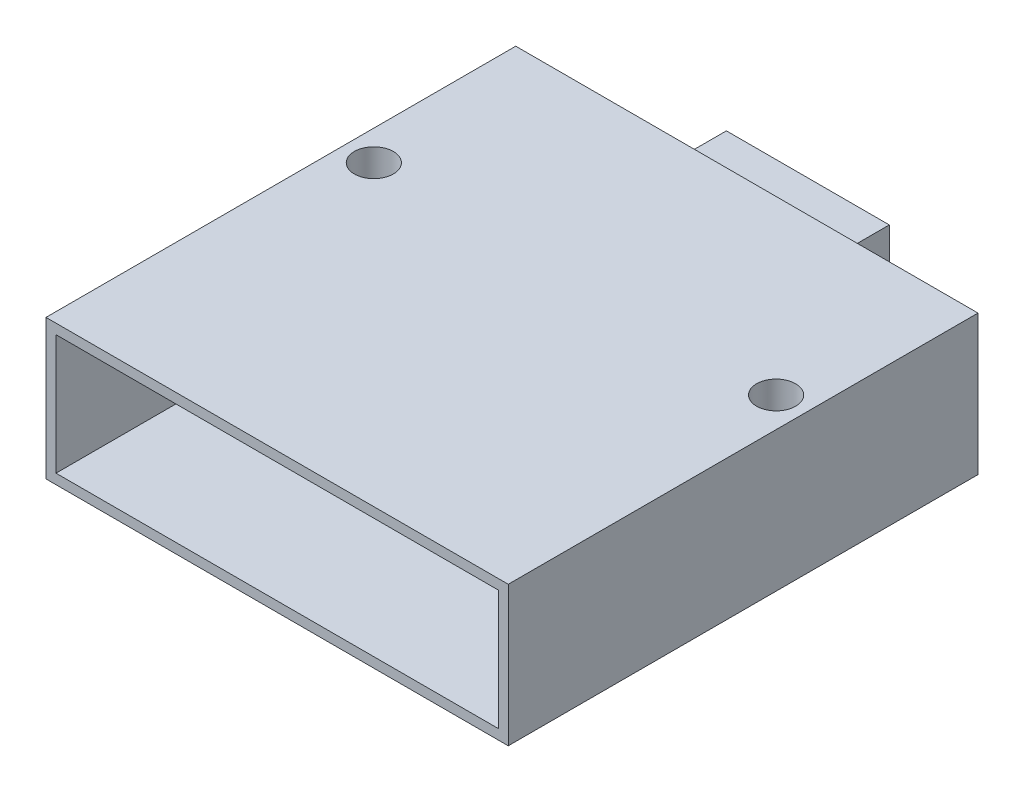
ISO-10303-21;
HEADER;
FILE_DESCRIPTION(('STEP AP214'),'2;1');
FILE_NAME('part.step','',(''),(''),'','','');
FILE_SCHEMA(('AUTOMOTIVE_DESIGN { 1 0 10303 214 1 1 1 1 }'));
ENDSEC;
DATA;
#1=APPLICATION_CONTEXT('core data for automotive mechanical design processes');
#2=APPLICATION_PROTOCOL_DEFINITION('international standard','automotive_design',2000,#1);
#3=PRODUCT_CONTEXT('',#1,'mechanical');
#4=PRODUCT('Part','Part','',(#3));
#5=PRODUCT_RELATED_PRODUCT_CATEGORY('part','',(#4));
#6=PRODUCT_DEFINITION_FORMATION('','',#4);
#7=PRODUCT_DEFINITION_CONTEXT('part definition',#1,'design');
#8=PRODUCT_DEFINITION('design','',#6,#7);
#9=PRODUCT_DEFINITION_SHAPE('','',#8);
#10=(LENGTH_UNIT() NAMED_UNIT(*) SI_UNIT(.MILLI.,.METRE.));
#11=(NAMED_UNIT(*) PLANE_ANGLE_UNIT() SI_UNIT($,.RADIAN.));
#12=(NAMED_UNIT(*) SI_UNIT($,.STERADIAN.) SOLID_ANGLE_UNIT());
#13=UNCERTAINTY_MEASURE_WITH_UNIT(LENGTH_MEASURE(1.E-05),#10,'distance_accuracy_value','');
#14=(GEOMETRIC_REPRESENTATION_CONTEXT(3) GLOBAL_UNCERTAINTY_ASSIGNED_CONTEXT((#13)) GLOBAL_UNIT_ASSIGNED_CONTEXT((#10,
#11,#12)) REPRESENTATION_CONTEXT('',''));
#15=CARTESIAN_POINT('',(0.,0.,0.));
#16=DIRECTION('',(0.,0.,1.));
#17=DIRECTION('',(1.,0.,0.));
#18=AXIS2_PLACEMENT_3D('',#15,#16,#17);
#19=CARTESIAN_POINT('',(58.7375,17.78,119.38));
#20=DIRECTION('',(0.,0.,-1.));
#21=DIRECTION('',(-1.,0.,0.));
#22=AXIS2_PLACEMENT_3D('',#19,#20,#21);
#23=PLANE('',#22);
#24=DIRECTION('',(0.,1.,0.));
#25=VECTOR('',#24,1.);
#26=CARTESIAN_POINT('',(58.7375,-17.78,119.38));
#27=LINE('',#26,#25);
#28=CARTESIAN_POINT('',(58.7375,-17.78,119.38));
#29=VERTEX_POINT('',#28);
#30=CARTESIAN_POINT('',(58.7375,17.78,119.38));
#31=VERTEX_POINT('',#30);
#32=EDGE_CURVE('E332',#29,#31,#27,.T.);
#33=ORIENTED_EDGE('',*,*,#32,.T.);
#34=DIRECTION('',(-1.,0.,0.));
#35=VECTOR('',#34,1.);
#36=CARTESIAN_POINT('',(-58.7375,17.78,119.38));
#37=LINE('',#36,#35);
#38=CARTESIAN_POINT('',(-58.7375,17.78,119.38));
#39=VERTEX_POINT('',#38);
#40=EDGE_CURVE('E335',#31,#39,#37,.T.);
#41=ORIENTED_EDGE('',*,*,#40,.T.);
#42=DIRECTION('',(0.,-1.,0.));
#43=VECTOR('',#42,1.);
#44=CARTESIAN_POINT('',(-58.7375,-17.78,119.38));
#45=LINE('',#44,#43);
#46=CARTESIAN_POINT('',(-58.7375,-17.78,119.38));
#47=VERTEX_POINT('',#46);
#48=EDGE_CURVE('E338',#39,#47,#45,.T.);
#49=ORIENTED_EDGE('',*,*,#48,.T.);
#50=DIRECTION('',(1.,0.,0.));
#51=VECTOR('',#50,1.);
#52=CARTESIAN_POINT('',(-58.7375,-17.78,119.38));
#53=LINE('',#52,#51);
#54=EDGE_CURVE('E340',#47,#29,#53,.T.);
#55=ORIENTED_EDGE('',*,*,#54,.T.);
#56=EDGE_LOOP('',(#33,#41,#49,#55));
#57=FACE_BOUND('',#56,.T.);
#58=DIRECTION('',(0.,1.,0.));
#59=VECTOR('',#58,1.);
#60=CARTESIAN_POINT('',(56.1975,17.78,119.38));
#61=LINE('',#60,#59);
#62=CARTESIAN_POINT('',(56.1975,-15.24,119.38));
#63=VERTEX_POINT('',#62);
#64=CARTESIAN_POINT('',(56.1975,15.24,119.38));
#65=VERTEX_POINT('',#64);
#66=EDGE_CURVE('E199',#63,#65,#61,.T.);
#67=ORIENTED_EDGE('',*,*,#66,.F.);
#68=DIRECTION('',(1.,0.,0.));
#69=VECTOR('',#68,1.);
#70=CARTESIAN_POINT('',(58.7375,-15.24,119.38));
#71=LINE('',#70,#69);
#72=CARTESIAN_POINT('',(-56.1975,-15.24,119.38));
#73=VERTEX_POINT('',#72);
#74=EDGE_CURVE('E279',#73,#63,#71,.T.);
#75=ORIENTED_EDGE('',*,*,#74,.F.);
#76=DIRECTION('',(0.,-1.,0.));
#77=VECTOR('',#76,1.);
#78=CARTESIAN_POINT('',(-56.1975,17.78,119.38));
#79=LINE('',#78,#77);
#80=CARTESIAN_POINT('',(-56.1975,15.24,119.38));
#81=VERTEX_POINT('',#80);
#82=EDGE_CURVE('E277',#81,#73,#79,.T.);
#83=ORIENTED_EDGE('',*,*,#82,.F.);
#84=DIRECTION('',(-1.,0.,0.));
#85=VECTOR('',#84,1.);
#86=CARTESIAN_POINT('',(58.7375,15.24,119.38));
#87=LINE('',#86,#85);
#88=EDGE_CURVE('E274',#65,#81,#87,.T.);
#89=ORIENTED_EDGE('',*,*,#88,.F.);
#90=EDGE_LOOP('',(#67,#75,#83,#89));
#91=FACE_BOUND('',#90,.T.);
#92=ADVANCED_FACE('F45',(#57,#91),#23,.F.);
#93=CARTESIAN_POINT('',(58.7375,17.78,0.));
#94=DIRECTION('',(0.,0.,-1.));
#95=DIRECTION('',(-1.,0.,0.));
#96=AXIS2_PLACEMENT_3D('',#93,#94,#95);
#97=PLANE('',#96);
#98=DIRECTION('',(0.,1.,0.));
#99=VECTOR('',#98,1.);
#100=CARTESIAN_POINT('',(58.7375,-17.78,0.));
#101=LINE('',#100,#99);
#102=CARTESIAN_POINT('',(58.7375,-17.78,0.));
#103=VERTEX_POINT('',#102);
#104=CARTESIAN_POINT('',(58.7375,17.78,0.));
#105=VERTEX_POINT('',#104);
#106=EDGE_CURVE('E331',#103,#105,#101,.T.);
#107=ORIENTED_EDGE('',*,*,#106,.F.);
#108=DIRECTION('',(1.,0.,0.));
#109=VECTOR('',#108,1.);
#110=CARTESIAN_POINT('',(-58.7375,-17.78,0.));
#111=LINE('',#110,#109);
#112=CARTESIAN_POINT('',(-58.7375,-17.78,0.));
#113=VERTEX_POINT('',#112);
#114=EDGE_CURVE('E336',#113,#103,#111,.T.);
#115=ORIENTED_EDGE('',*,*,#114,.F.);
#116=DIRECTION('',(0.,-1.,0.));
#117=VECTOR('',#116,1.);
#118=CARTESIAN_POINT('',(-58.7375,-17.78,0.));
#119=LINE('',#118,#117);
#120=CARTESIAN_POINT('',(-58.7375,17.78,0.));
#121=VERTEX_POINT('',#120);
#122=EDGE_CURVE('E347',#121,#113,#119,.T.);
#123=ORIENTED_EDGE('',*,*,#122,.F.);
#124=DIRECTION('',(-1.,0.,0.));
#125=VECTOR('',#124,1.);
#126=CARTESIAN_POINT('',(-58.7375,17.78,0.));
#127=LINE('',#126,#125);
#128=EDGE_CURVE('E345',#105,#121,#127,.T.);
#129=ORIENTED_EDGE('',*,*,#128,.F.);
#130=EDGE_LOOP('',(#107,#115,#123,#129));
#131=FACE_BOUND('',#130,.T.);
#132=DIRECTION('',(1.,0.,0.));
#133=VECTOR('',#132,1.);
#134=CARTESIAN_POINT('',(20.701,10.414,0.));
#135=LINE('',#134,#133);
#136=CARTESIAN_POINT('',(-20.701,10.414,0.));
#137=VERTEX_POINT('',#136);
#138=CARTESIAN_POINT('',(20.701,10.414,0.));
#139=VERTEX_POINT('',#138);
#140=EDGE_CURVE('E318',#137,#139,#135,.T.);
#141=ORIENTED_EDGE('',*,*,#140,.F.);
#142=DIRECTION('',(0.,1.,0.));
#143=VECTOR('',#142,1.);
#144=CARTESIAN_POINT('',(-20.701,-10.414,0.));
#145=LINE('',#144,#143);
#146=CARTESIAN_POINT('',(-20.701,-10.414,0.));
#147=VERTEX_POINT('',#146);
#148=EDGE_CURVE('E304',#147,#137,#145,.T.);
#149=ORIENTED_EDGE('',*,*,#148,.F.);
#150=DIRECTION('',(-1.,0.,0.));
#151=VECTOR('',#150,1.);
#152=CARTESIAN_POINT('',(20.701,-10.414,0.));
#153=LINE('',#152,#151);
#154=CARTESIAN_POINT('',(20.701,-10.414,0.));
#155=VERTEX_POINT('',#154);
#156=EDGE_CURVE('E309',#155,#147,#153,.T.);
#157=ORIENTED_EDGE('',*,*,#156,.F.);
#158=DIRECTION('',(0.,-1.,0.));
#159=VECTOR('',#158,1.);
#160=CARTESIAN_POINT('',(20.701,-10.414,0.));
#161=LINE('',#160,#159);
#162=EDGE_CURVE('E320',#139,#155,#161,.T.);
#163=ORIENTED_EDGE('',*,*,#162,.F.);
#164=EDGE_LOOP('',(#141,#149,#157,#163));
#165=FACE_BOUND('',#164,.T.);
#166=ADVANCED_FACE('F368',(#131,#165),#97,.T.);
#167=CARTESIAN_POINT('',(58.7375,-17.78,119.38));
#168=DIRECTION('',(-1.,0.,0.));
#169=DIRECTION('',(0.,0.,1.));
#170=AXIS2_PLACEMENT_3D('',#167,#168,#169);
#171=PLANE('',#170);
#172=ORIENTED_EDGE('',*,*,#106,.T.);
#173=DIRECTION('',(0.,0.,-1.));
#174=VECTOR('',#173,1.);
#175=CARTESIAN_POINT('',(58.7375,17.78,119.38));
#176=LINE('',#175,#174);
#177=EDGE_CURVE('E11',#31,#105,#176,.T.);
#178=ORIENTED_EDGE('',*,*,#177,.F.);
#179=ORIENTED_EDGE('',*,*,#32,.F.);
#180=DIRECTION('',(0.,0.,-1.));
#181=VECTOR('',#180,1.);
#182=CARTESIAN_POINT('',(58.7375,-17.78,119.38));
#183=LINE('',#182,#181);
#184=EDGE_CURVE('E342',#29,#103,#183,.T.);
#185=ORIENTED_EDGE('',*,*,#184,.T.);
#186=EDGE_LOOP('',(#172,#178,#179,#185));
#187=FACE_BOUND('',#186,.T.);
#188=ADVANCED_FACE('F47',(#187),#171,.F.);
#189=CARTESIAN_POINT('',(-58.7375,17.78,119.38));
#190=DIRECTION('',(0.,-1.,0.));
#191=DIRECTION('',(0.,0.,-1.));
#192=AXIS2_PLACEMENT_3D('',#189,#190,#191);
#193=PLANE('',#192);
#194=CARTESIAN_POINT('',(-51.1175,17.78,43.688));
#195=DIRECTION('',(0.,-1.,0.));
#196=DIRECTION('',(0.,0.,-1.));
#197=AXIS2_PLACEMENT_3D('',#194,#195,#196);
#198=CIRCLE('',#197,4.96100099999999);
#199=CARTESIAN_POINT('',(-51.1175,17.78,38.726999));
#200=VERTEX_POINT('',#199);
#201=EDGE_CURVE('E294',#200,#200,#198,.T.);
#202=ORIENTED_EDGE('',*,*,#201,.T.);
#203=EDGE_LOOP('',(#202));
#204=FACE_BOUND('',#203,.T.);
#205=CARTESIAN_POINT('',(51.1175,17.78,43.688));
#206=DIRECTION('',(0.,-1.,0.));
#207=DIRECTION('',(0.,0.,-1.));
#208=AXIS2_PLACEMENT_3D('',#205,#206,#207);
#209=CIRCLE('',#208,4.96100099999999);
#210=CARTESIAN_POINT('',(51.1175,17.78,38.726999));
#211=VERTEX_POINT('',#210);
#212=EDGE_CURVE('E301',#211,#211,#209,.T.);
#213=ORIENTED_EDGE('',*,*,#212,.T.);
#214=EDGE_LOOP('',(#213));
#215=FACE_BOUND('',#214,.T.);
#216=ORIENTED_EDGE('',*,*,#128,.T.);
#217=DIRECTION('',(0.,0.,-1.));
#218=VECTOR('',#217,1.);
#219=CARTESIAN_POINT('',(-58.7375,17.78,119.38));
#220=LINE('',#219,#218);
#221=EDGE_CURVE('E54',#39,#121,#220,.T.);
#222=ORIENTED_EDGE('',*,*,#221,.F.);
#223=ORIENTED_EDGE('',*,*,#40,.F.);
#224=ORIENTED_EDGE('',*,*,#177,.T.);
#225=EDGE_LOOP('',(#216,#222,#223,#224));
#226=FACE_BOUND('',#225,.T.);
#227=ADVANCED_FACE('F379',(#204,#215,#226),#193,.F.);
#228=CARTESIAN_POINT('',(-58.7375,-17.78,119.38));
#229=DIRECTION('',(1.,0.,0.));
#230=DIRECTION('',(0.,0.,-1.));
#231=AXIS2_PLACEMENT_3D('',#228,#229,#230);
#232=PLANE('',#231);
#233=ORIENTED_EDGE('',*,*,#122,.T.);
#234=DIRECTION('',(0.,0.,-1.));
#235=VECTOR('',#234,1.);
#236=CARTESIAN_POINT('',(-58.7375,-17.78,119.38));
#237=LINE('',#236,#235);
#238=EDGE_CURVE('E353',#47,#113,#237,.T.);
#239=ORIENTED_EDGE('',*,*,#238,.F.);
#240=ORIENTED_EDGE('',*,*,#48,.F.);
#241=ORIENTED_EDGE('',*,*,#221,.T.);
#242=EDGE_LOOP('',(#233,#239,#240,#241));
#243=FACE_BOUND('',#242,.T.);
#244=ADVANCED_FACE('F362',(#243),#232,.F.);
#245=CARTESIAN_POINT('',(-58.7375,-17.78,119.38));
#246=DIRECTION('',(0.,1.,0.));
#247=DIRECTION('',(0.,0.,1.));
#248=AXIS2_PLACEMENT_3D('',#245,#246,#247);
#249=PLANE('',#248);
#250=CARTESIAN_POINT('',(-51.1175,-17.78,43.688));
#251=DIRECTION('',(0.,-1.,0.));
#252=DIRECTION('',(0.,0.,-1.));
#253=AXIS2_PLACEMENT_3D('',#250,#251,#252);
#254=CIRCLE('',#253,4.96100099999999);
#255=CARTESIAN_POINT('',(-51.1175,-17.78,38.726999));
#256=VERTEX_POINT('',#255);
#257=EDGE_CURVE('E290',#256,#256,#254,.T.);
#258=ORIENTED_EDGE('',*,*,#257,.F.);
#259=EDGE_LOOP('',(#258));
#260=FACE_BOUND('',#259,.T.);
#261=CARTESIAN_POINT('',(51.1175,-17.78,43.688));
#262=DIRECTION('',(0.,-1.,0.));
#263=DIRECTION('',(0.,0.,-1.));
#264=AXIS2_PLACEMENT_3D('',#261,#262,#263);
#265=CIRCLE('',#264,4.96100099999999);
#266=CARTESIAN_POINT('',(51.1175,-17.78,38.726999));
#267=VERTEX_POINT('',#266);
#268=EDGE_CURVE('E298',#267,#267,#265,.T.);
#269=ORIENTED_EDGE('',*,*,#268,.F.);
#270=EDGE_LOOP('',(#269));
#271=FACE_BOUND('',#270,.T.);
#272=ORIENTED_EDGE('',*,*,#114,.T.);
#273=ORIENTED_EDGE('',*,*,#184,.F.);
#274=ORIENTED_EDGE('',*,*,#54,.F.);
#275=ORIENTED_EDGE('',*,*,#238,.T.);
#276=EDGE_LOOP('',(#272,#273,#274,#275));
#277=FACE_BOUND('',#276,.T.);
#278=ADVANCED_FACE('F372',(#260,#271,#277),#249,.F.);
#279=CARTESIAN_POINT('',(-20.701,-10.414,-15.494));
#280=DIRECTION('',(1.,0.,0.));
#281=DIRECTION('',(0.,0.,-1.));
#282=AXIS2_PLACEMENT_3D('',#279,#280,#281);
#283=PLANE('',#282);
#284=ORIENTED_EDGE('',*,*,#148,.T.);
#285=DIRECTION('',(0.,0.,1.));
#286=VECTOR('',#285,1.);
#287=CARTESIAN_POINT('',(-20.701,10.414,-15.494));
#288=LINE('',#287,#286);
#289=CARTESIAN_POINT('',(-20.701,10.414,-15.494));
#290=VERTEX_POINT('',#289);
#291=EDGE_CURVE('E329',#290,#137,#288,.T.);
#292=ORIENTED_EDGE('',*,*,#291,.F.);
#293=DIRECTION('',(0.,1.,0.));
#294=VECTOR('',#293,1.);
#295=CARTESIAN_POINT('',(-20.701,-10.414,-15.494));
#296=LINE('',#295,#294);
#297=CARTESIAN_POINT('',(-20.701,-10.414,-15.494));
#298=VERTEX_POINT('',#297);
#299=EDGE_CURVE('E305',#298,#290,#296,.T.);
#300=ORIENTED_EDGE('',*,*,#299,.F.);
#301=DIRECTION('',(0.,0.,1.));
#302=VECTOR('',#301,1.);
#303=CARTESIAN_POINT('',(-20.701,-10.414,-15.494));
#304=LINE('',#303,#302);
#305=EDGE_CURVE('E315',#298,#147,#304,.T.);
#306=ORIENTED_EDGE('',*,*,#305,.T.);
#307=EDGE_LOOP('',(#284,#292,#300,#306));
#308=FACE_BOUND('',#307,.T.);
#309=ADVANCED_FACE('F395',(#308),#283,.F.);
#310=CARTESIAN_POINT('',(20.701,10.414,-15.494));
#311=DIRECTION('',(0.,-1.,0.));
#312=DIRECTION('',(0.,0.,-1.));
#313=AXIS2_PLACEMENT_3D('',#310,#311,#312);
#314=PLANE('',#313);
#315=ORIENTED_EDGE('',*,*,#140,.T.);
#316=DIRECTION('',(0.,0.,1.));
#317=VECTOR('',#316,1.);
#318=CARTESIAN_POINT('',(20.701,10.414,-15.494));
#319=LINE('',#318,#317);
#320=CARTESIAN_POINT('',(20.701,10.414,-15.494));
#321=VERTEX_POINT('',#320);
#322=EDGE_CURVE('E326',#321,#139,#319,.T.);
#323=ORIENTED_EDGE('',*,*,#322,.F.);
#324=DIRECTION('',(1.,0.,0.));
#325=VECTOR('',#324,1.);
#326=CARTESIAN_POINT('',(20.701,10.414,-15.494));
#327=LINE('',#326,#325);
#328=EDGE_CURVE('E308',#290,#321,#327,.T.);
#329=ORIENTED_EDGE('',*,*,#328,.F.);
#330=ORIENTED_EDGE('',*,*,#291,.T.);
#331=EDGE_LOOP('',(#315,#323,#329,#330));
#332=FACE_BOUND('',#331,.T.);
#333=ADVANCED_FACE('F403',(#332),#314,.F.);
#334=CARTESIAN_POINT('',(20.701,-10.414,-15.494));
#335=DIRECTION('',(-1.,0.,0.));
#336=DIRECTION('',(0.,0.,1.));
#337=AXIS2_PLACEMENT_3D('',#334,#335,#336);
#338=PLANE('',#337);
#339=ORIENTED_EDGE('',*,*,#162,.T.);
#340=DIRECTION('',(0.,0.,1.));
#341=VECTOR('',#340,1.);
#342=CARTESIAN_POINT('',(20.701,-10.414,-15.494));
#343=LINE('',#342,#341);
#344=CARTESIAN_POINT('',(20.701,-10.414,-15.494));
#345=VERTEX_POINT('',#344);
#346=EDGE_CURVE('E69',#345,#155,#343,.T.);
#347=ORIENTED_EDGE('',*,*,#346,.F.);
#348=DIRECTION('',(0.,-1.,0.));
#349=VECTOR('',#348,1.);
#350=CARTESIAN_POINT('',(20.701,-10.414,-15.494));
#351=LINE('',#350,#349);
#352=EDGE_CURVE('E311',#321,#345,#351,.T.);
#353=ORIENTED_EDGE('',*,*,#352,.F.);
#354=ORIENTED_EDGE('',*,*,#322,.T.);
#355=EDGE_LOOP('',(#339,#347,#353,#354));
#356=FACE_BOUND('',#355,.T.);
#357=ADVANCED_FACE('F430',(#356),#338,.F.);
#358=CARTESIAN_POINT('',(20.701,-10.414,-15.494));
#359=DIRECTION('',(0.,1.,0.));
#360=DIRECTION('',(0.,0.,1.));
#361=AXIS2_PLACEMENT_3D('',#358,#359,#360);
#362=PLANE('',#361);
#363=ORIENTED_EDGE('',*,*,#156,.T.);
#364=ORIENTED_EDGE('',*,*,#305,.F.);
#365=DIRECTION('',(-1.,0.,0.));
#366=VECTOR('',#365,1.);
#367=CARTESIAN_POINT('',(20.701,-10.414,-15.494));
#368=LINE('',#367,#366);
#369=EDGE_CURVE('E313',#345,#298,#368,.T.);
#370=ORIENTED_EDGE('',*,*,#369,.F.);
#371=ORIENTED_EDGE('',*,*,#346,.T.);
#372=EDGE_LOOP('',(#363,#364,#370,#371));
#373=FACE_BOUND('',#372,.T.);
#374=ADVANCED_FACE('F422',(#373),#362,.F.);
#375=CARTESIAN_POINT('',(-20.701,10.414,-15.494));
#376=DIRECTION('',(0.,0.,1.));
#377=DIRECTION('',(1.,0.,0.));
#378=AXIS2_PLACEMENT_3D('',#375,#376,#377);
#379=PLANE('',#378);
#380=ORIENTED_EDGE('',*,*,#299,.T.);
#381=ORIENTED_EDGE('',*,*,#328,.T.);
#382=ORIENTED_EDGE('',*,*,#352,.T.);
#383=ORIENTED_EDGE('',*,*,#369,.T.);
#384=EDGE_LOOP('',(#380,#381,#382,#383));
#385=FACE_BOUND('',#384,.T.);
#386=ADVANCED_FACE('F412',(#385),#379,.F.);
#387=CARTESIAN_POINT('',(51.1175,-17.78,43.688));
#388=DIRECTION('',(0.,-1.,0.));
#389=DIRECTION('',(0.,0.,-1.));
#390=AXIS2_PLACEMENT_3D('',#387,#388,#389);
#391=CYLINDRICAL_SURFACE('',#390,4.96100099999999);
#392=ORIENTED_EDGE('',*,*,#212,.F.);
#393=EDGE_LOOP('',(#392));
#394=FACE_BOUND('',#393,.T.);
#395=ORIENTED_EDGE('',*,*,#268,.T.);
#396=EDGE_LOOP('',(#395));
#397=FACE_BOUND('',#396,.T.);
#398=ADVANCED_FACE('F409',(#394,#397),#391,.F.);
#399=CARTESIAN_POINT('',(-51.1175,-17.78,43.688));
#400=DIRECTION('',(0.,-1.,0.));
#401=DIRECTION('',(0.,0.,-1.));
#402=AXIS2_PLACEMENT_3D('',#399,#400,#401);
#403=CYLINDRICAL_SURFACE('',#402,4.96100099999999);
#404=ORIENTED_EDGE('',*,*,#201,.F.);
#405=EDGE_LOOP('',(#404));
#406=FACE_BOUND('',#405,.T.);
#407=ORIENTED_EDGE('',*,*,#257,.T.);
#408=EDGE_LOOP('',(#407));
#409=FACE_BOUND('',#408,.T.);
#410=ADVANCED_FACE('F411',(#406,#409),#403,.F.);
#411=CARTESIAN_POINT('',(-56.1975,-17.78,119.38));
#412=DIRECTION('',(1.,0.,0.));
#413=DIRECTION('',(0.,0.,-1.));
#414=AXIS2_PLACEMENT_3D('',#411,#412,#413);
#415=PLANE('',#414);
#416=DIRECTION('',(0.,-1.,0.));
#417=VECTOR('',#416,1.);
#418=CARTESIAN_POINT('',(-56.1975,-17.78,49.2069325056573));
#419=LINE('',#418,#417);
#420=CARTESIAN_POINT('',(-56.1975,-15.24,49.2069325056573));
#421=VERTEX_POINT('',#420);
#422=CARTESIAN_POINT('',(-56.1975,15.24,49.2069325056573));
#423=VERTEX_POINT('',#422);
#424=EDGE_CURVE('E287',#421,#423,#419,.F.);
#425=ORIENTED_EDGE('',*,*,#424,.T.);
#426=DIRECTION('',(0.,0.,-1.));
#427=VECTOR('',#426,1.);
#428=CARTESIAN_POINT('',(-56.1975,15.24,119.38));
#429=LINE('',#428,#427);
#430=EDGE_CURVE('E252',#81,#423,#429,.T.);
#431=ORIENTED_EDGE('',*,*,#430,.F.);
#432=ORIENTED_EDGE('',*,*,#82,.T.);
#433=DIRECTION('',(0.,0.,-1.));
#434=VECTOR('',#433,1.);
#435=CARTESIAN_POINT('',(-56.1975,-15.24,119.38));
#436=LINE('',#435,#434);
#437=EDGE_CURVE('E61',#73,#421,#436,.T.);
#438=ORIENTED_EDGE('',*,*,#437,.T.);
#439=EDGE_LOOP('',(#425,#431,#432,#438));
#440=FACE_BOUND('',#439,.T.);
#441=ADVANCED_FACE('F419',(#440),#415,.T.);
#442=CARTESIAN_POINT('',(56.1975,-17.78,119.38));
#443=DIRECTION('',(-1.,0.,0.));
#444=DIRECTION('',(0.,0.,1.));
#445=AXIS2_PLACEMENT_3D('',#442,#443,#444);
#446=PLANE('',#445);
#447=DIRECTION('',(0.,0.,-1.));
#448=VECTOR('',#447,1.);
#449=CARTESIAN_POINT('',(56.1975,-15.24,119.38));
#450=LINE('',#449,#448);
#451=CARTESIAN_POINT('',(56.1975,-15.24,49.2069325056573));
#452=VERTEX_POINT('',#451);
#453=EDGE_CURVE('E210',#63,#452,#450,.T.);
#454=ORIENTED_EDGE('',*,*,#453,.F.);
#455=ORIENTED_EDGE('',*,*,#66,.T.);
#456=DIRECTION('',(0.,0.,-1.));
#457=VECTOR('',#456,1.);
#458=CARTESIAN_POINT('',(56.1975,15.24,119.38));
#459=LINE('',#458,#457);
#460=CARTESIAN_POINT('',(56.1975,15.24,49.2069325056573));
#461=VERTEX_POINT('',#460);
#462=EDGE_CURVE('E236',#65,#461,#459,.T.);
#463=ORIENTED_EDGE('',*,*,#462,.T.);
#464=DIRECTION('',(0.,-1.,0.));
#465=VECTOR('',#464,1.);
#466=CARTESIAN_POINT('',(56.1975,-17.78,49.2069325056573));
#467=LINE('',#466,#465);
#468=EDGE_CURVE('E282',#452,#461,#467,.F.);
#469=ORIENTED_EDGE('',*,*,#468,.F.);
#470=EDGE_LOOP('',(#454,#455,#463,#469));
#471=FACE_BOUND('',#470,.T.);
#472=ADVANCED_FACE('F496',(#471),#446,.T.);
#473=CARTESIAN_POINT('',(58.7375,17.78,2.54));
#474=DIRECTION('',(0.,0.,-1.));
#475=DIRECTION('',(-1.,0.,0.));
#476=AXIS2_PLACEMENT_3D('',#473,#474,#475);
#477=PLANE('',#476);
#478=DIRECTION('',(0.,1.,0.));
#479=VECTOR('',#478,1.);
#480=CARTESIAN_POINT('',(56.1975,17.78,2.54));
#481=LINE('',#480,#479);
#482=CARTESIAN_POINT('',(56.1975,-15.24,2.54));
#483=VERTEX_POINT('',#482);
#484=CARTESIAN_POINT('',(56.1975,15.24,2.54));
#485=VERTEX_POINT('',#484);
#486=EDGE_CURVE('E195',#483,#485,#481,.T.);
#487=ORIENTED_EDGE('',*,*,#486,.T.);
#488=DIRECTION('',(-1.,0.,0.));
#489=VECTOR('',#488,1.);
#490=CARTESIAN_POINT('',(58.7375,15.24,2.54));
#491=LINE('',#490,#489);
#492=CARTESIAN_POINT('',(-56.1975,15.24,2.54));
#493=VERTEX_POINT('',#492);
#494=EDGE_CURVE('E216',#485,#493,#491,.T.);
#495=ORIENTED_EDGE('',*,*,#494,.T.);
#496=DIRECTION('',(0.,-1.,0.));
#497=VECTOR('',#496,1.);
#498=CARTESIAN_POINT('',(-56.1975,17.78,2.54));
#499=LINE('',#498,#497);
#500=CARTESIAN_POINT('',(-56.1975,-15.24,2.54));
#501=VERTEX_POINT('',#500);
#502=EDGE_CURVE('E197',#493,#501,#499,.T.);
#503=ORIENTED_EDGE('',*,*,#502,.T.);
#504=DIRECTION('',(1.,0.,0.));
#505=VECTOR('',#504,1.);
#506=CARTESIAN_POINT('',(58.7375,-15.24,2.54));
#507=LINE('',#506,#505);
#508=EDGE_CURVE('E190',#501,#483,#507,.T.);
#509=ORIENTED_EDGE('',*,*,#508,.T.);
#510=EDGE_LOOP('',(#487,#495,#503,#509));
#511=FACE_BOUND('',#510,.T.);
#512=DIRECTION('',(1.,0.,0.));
#513=VECTOR('',#512,1.);
#514=CARTESIAN_POINT('',(20.701,7.874,2.54));
#515=LINE('',#514,#513);
#516=CARTESIAN_POINT('',(-18.161,7.874,2.54));
#517=VERTEX_POINT('',#516);
#518=CARTESIAN_POINT('',(18.161,7.874,2.54));
#519=VERTEX_POINT('',#518);
#520=EDGE_CURVE('E224',#517,#519,#515,.T.);
#521=ORIENTED_EDGE('',*,*,#520,.T.);
#522=DIRECTION('',(0.,-1.,0.));
#523=VECTOR('',#522,1.);
#524=CARTESIAN_POINT('',(18.161,-10.414,2.54));
#525=LINE('',#524,#523);
#526=CARTESIAN_POINT('',(18.161,-7.874,2.54));
#527=VERTEX_POINT('',#526);
#528=EDGE_CURVE('E226',#519,#527,#525,.T.);
#529=ORIENTED_EDGE('',*,*,#528,.T.);
#530=DIRECTION('',(-1.,0.,0.));
#531=VECTOR('',#530,1.);
#532=CARTESIAN_POINT('',(20.701,-7.874,2.54));
#533=LINE('',#532,#531);
#534=CARTESIAN_POINT('',(-18.161,-7.874,2.54));
#535=VERTEX_POINT('',#534);
#536=EDGE_CURVE('E231',#527,#535,#533,.T.);
#537=ORIENTED_EDGE('',*,*,#536,.T.);
#538=DIRECTION('',(0.,1.,0.));
#539=VECTOR('',#538,1.);
#540=CARTESIAN_POINT('',(-18.161,-10.414,2.54));
#541=LINE('',#540,#539);
#542=EDGE_CURVE('E227',#535,#517,#541,.T.);
#543=ORIENTED_EDGE('',*,*,#542,.T.);
#544=EDGE_LOOP('',(#521,#529,#537,#543));
#545=FACE_BOUND('',#544,.T.);
#546=ADVANCED_FACE('F192',(#511,#545),#477,.F.);
#547=DIRECTION('',(0.,-1.,0.));
#548=VECTOR('',#547,1.);
#549=CARTESIAN_POINT('',(56.1975,-17.78,38.1690674943427));
#550=LINE('',#549,#548);
#551=CARTESIAN_POINT('',(56.1975,-15.24,38.1690674943427));
#552=VERTEX_POINT('',#551);
#553=CARTESIAN_POINT('',(56.1975,15.24,38.1690674943427));
#554=VERTEX_POINT('',#553);
#555=EDGE_CURVE('E239',#552,#554,#550,.F.);
#556=ORIENTED_EDGE('',*,*,#555,.T.);
#557=EDGE_CURVE('E214',#554,#485,#459,.T.);
#558=ORIENTED_EDGE('',*,*,#557,.T.);
#559=ORIENTED_EDGE('',*,*,#486,.F.);
#560=EDGE_CURVE('E203',#552,#483,#450,.T.);
#561=ORIENTED_EDGE('',*,*,#560,.F.);
#562=EDGE_LOOP('',(#556,#558,#559,#561));
#563=FACE_BOUND('',#562,.T.);
#564=ADVANCED_FACE('F212',(#563),#446,.T.);
#565=CARTESIAN_POINT('',(-58.7375,15.24,119.38));
#566=DIRECTION('',(0.,-1.,0.));
#567=DIRECTION('',(0.,0.,-1.));
#568=AXIS2_PLACEMENT_3D('',#565,#566,#567);
#569=PLANE('',#568);
#570=CARTESIAN_POINT('',(-56.1975,15.24,38.1690674943427));
#571=VERTEX_POINT('',#570);
#572=EDGE_CURVE('E248',#571,#493,#429,.T.);
#573=ORIENTED_EDGE('',*,*,#572,.T.);
#574=ORIENTED_EDGE('',*,*,#494,.F.);
#575=ORIENTED_EDGE('',*,*,#557,.F.);
#576=CARTESIAN_POINT('',(51.1175,15.24,43.688));
#577=DIRECTION('',(0.,-1.,0.));
#578=DIRECTION('',(0.,0.,-1.));
#579=AXIS2_PLACEMENT_3D('',#576,#577,#578);
#580=CIRCLE('',#579,7.50100099999999);
#581=EDGE_CURVE('E230',#461,#554,#580,.T.);
#582=ORIENTED_EDGE('',*,*,#581,.F.);
#583=ORIENTED_EDGE('',*,*,#462,.F.);
#584=ORIENTED_EDGE('',*,*,#88,.T.);
#585=ORIENTED_EDGE('',*,*,#430,.T.);
#586=CARTESIAN_POINT('',(-51.1175,15.24,43.688));
#587=DIRECTION('',(0.,-1.,0.));
#588=DIRECTION('',(0.,0.,-1.));
#589=AXIS2_PLACEMENT_3D('',#586,#587,#588);
#590=CIRCLE('',#589,7.50100099999999);
#591=EDGE_CURVE('E241',#571,#423,#590,.T.);
#592=ORIENTED_EDGE('',*,*,#591,.F.);
#593=EDGE_LOOP('',(#573,#574,#575,#582,#583,#584,#585,#592));
#594=FACE_BOUND('',#593,.T.);
#595=ADVANCED_FACE('F527',(#594),#569,.T.);
#596=CARTESIAN_POINT('',(-56.1975,-15.24,38.1690674943427));
#597=VERTEX_POINT('',#596);
#598=EDGE_CURVE('E209',#597,#501,#436,.T.);
#599=ORIENTED_EDGE('',*,*,#598,.T.);
#600=ORIENTED_EDGE('',*,*,#502,.F.);
#601=ORIENTED_EDGE('',*,*,#572,.F.);
#602=DIRECTION('',(0.,-1.,0.));
#603=VECTOR('',#602,1.);
#604=CARTESIAN_POINT('',(-56.1975,-17.78,38.1690674943427));
#605=LINE('',#604,#603);
#606=EDGE_CURVE('E284',#597,#571,#605,.F.);
#607=ORIENTED_EDGE('',*,*,#606,.F.);
#608=EDGE_LOOP('',(#599,#600,#601,#607));
#609=FACE_BOUND('',#608,.T.);
#610=ADVANCED_FACE('F499',(#609),#415,.T.);
#611=CARTESIAN_POINT('',(-58.7375,-15.24,119.38));
#612=DIRECTION('',(0.,1.,0.));
#613=DIRECTION('',(0.,0.,1.));
#614=AXIS2_PLACEMENT_3D('',#611,#612,#613);
#615=PLANE('',#614);
#616=ORIENTED_EDGE('',*,*,#560,.T.);
#617=ORIENTED_EDGE('',*,*,#508,.F.);
#618=ORIENTED_EDGE('',*,*,#598,.F.);
#619=CARTESIAN_POINT('',(-51.1175,-15.24,43.688));
#620=DIRECTION('',(0.,1.,0.));
#621=DIRECTION('',(0.,0.,1.));
#622=AXIS2_PLACEMENT_3D('',#619,#620,#621);
#623=CIRCLE('',#622,7.50100099999999);
#624=EDGE_CURVE('E245',#597,#421,#623,.F.);
#625=ORIENTED_EDGE('',*,*,#624,.T.);
#626=ORIENTED_EDGE('',*,*,#437,.F.);
#627=ORIENTED_EDGE('',*,*,#74,.T.);
#628=ORIENTED_EDGE('',*,*,#453,.T.);
#629=CARTESIAN_POINT('',(51.1175,-15.24,43.688));
#630=DIRECTION('',(0.,1.,0.));
#631=DIRECTION('',(0.,0.,1.));
#632=AXIS2_PLACEMENT_3D('',#629,#630,#631);
#633=CIRCLE('',#632,7.50100099999999);
#634=EDGE_CURVE('E207',#452,#552,#633,.F.);
#635=ORIENTED_EDGE('',*,*,#634,.T.);
#636=EDGE_LOOP('',(#616,#617,#618,#625,#626,#627,#628,#635));
#637=FACE_BOUND('',#636,.T.);
#638=ADVANCED_FACE('F204',(#637),#615,.T.);
#639=CARTESIAN_POINT('',(-18.161,-10.414,-15.494));
#640=DIRECTION('',(1.,0.,0.));
#641=DIRECTION('',(0.,0.,-1.));
#642=AXIS2_PLACEMENT_3D('',#639,#640,#641);
#643=PLANE('',#642);
#644=ORIENTED_EDGE('',*,*,#542,.F.);
#645=DIRECTION('',(0.,0.,1.));
#646=VECTOR('',#645,1.);
#647=CARTESIAN_POINT('',(-18.161,-7.874,-15.494));
#648=LINE('',#647,#646);
#649=CARTESIAN_POINT('',(-18.161,-7.874,-12.954));
#650=VERTEX_POINT('',#649);
#651=EDGE_CURVE('E261',#650,#535,#648,.T.);
#652=ORIENTED_EDGE('',*,*,#651,.F.);
#653=DIRECTION('',(0.,1.,0.));
#654=VECTOR('',#653,1.);
#655=CARTESIAN_POINT('',(-18.161,10.414,-12.954));
#656=LINE('',#655,#654);
#657=CARTESIAN_POINT('',(-18.161,7.874,-12.954));
#658=VERTEX_POINT('',#657);
#659=EDGE_CURVE('E233',#650,#658,#656,.T.);
#660=ORIENTED_EDGE('',*,*,#659,.T.);
#661=DIRECTION('',(0.,0.,1.));
#662=VECTOR('',#661,1.);
#663=CARTESIAN_POINT('',(-18.161,7.874,-15.494));
#664=LINE('',#663,#662);
#665=EDGE_CURVE('E217',#658,#517,#664,.T.);
#666=ORIENTED_EDGE('',*,*,#665,.T.);
#667=EDGE_LOOP('',(#644,#652,#660,#666));
#668=FACE_BOUND('',#667,.T.);
#669=ADVANCED_FACE('F549',(#668),#643,.T.);
#670=CARTESIAN_POINT('',(20.701,7.874,-15.494));
#671=DIRECTION('',(0.,-1.,0.));
#672=DIRECTION('',(0.,0.,-1.));
#673=AXIS2_PLACEMENT_3D('',#670,#671,#672);
#674=PLANE('',#673);
#675=ORIENTED_EDGE('',*,*,#520,.F.);
#676=ORIENTED_EDGE('',*,*,#665,.F.);
#677=DIRECTION('',(1.,0.,0.));
#678=VECTOR('',#677,1.);
#679=CARTESIAN_POINT('',(-20.701,7.874,-12.954));
#680=LINE('',#679,#678);
#681=CARTESIAN_POINT('',(18.161,7.874,-12.954));
#682=VERTEX_POINT('',#681);
#683=EDGE_CURVE('E260',#658,#682,#680,.T.);
#684=ORIENTED_EDGE('',*,*,#683,.T.);
#685=DIRECTION('',(0.,0.,1.));
#686=VECTOR('',#685,1.);
#687=CARTESIAN_POINT('',(18.161,7.874,-15.494));
#688=LINE('',#687,#686);
#689=EDGE_CURVE('E220',#682,#519,#688,.T.);
#690=ORIENTED_EDGE('',*,*,#689,.T.);
#691=EDGE_LOOP('',(#675,#676,#684,#690));
#692=FACE_BOUND('',#691,.T.);
#693=ADVANCED_FACE('F558',(#692),#674,.T.);
#694=CARTESIAN_POINT('',(18.161,-10.414,-15.494));
#695=DIRECTION('',(-1.,0.,0.));
#696=DIRECTION('',(0.,0.,1.));
#697=AXIS2_PLACEMENT_3D('',#694,#695,#696);
#698=PLANE('',#697);
#699=ORIENTED_EDGE('',*,*,#528,.F.);
#700=ORIENTED_EDGE('',*,*,#689,.F.);
#701=DIRECTION('',(0.,-1.,0.));
#702=VECTOR('',#701,1.);
#703=CARTESIAN_POINT('',(18.161,10.414,-12.954));
#704=LINE('',#703,#702);
#705=CARTESIAN_POINT('',(18.161,-7.874,-12.954));
#706=VERTEX_POINT('',#705);
#707=EDGE_CURVE('E269',#682,#706,#704,.T.);
#708=ORIENTED_EDGE('',*,*,#707,.T.);
#709=DIRECTION('',(0.,0.,1.));
#710=VECTOR('',#709,1.);
#711=CARTESIAN_POINT('',(18.161,-7.874,-15.494));
#712=LINE('',#711,#710);
#713=EDGE_CURVE('E264',#706,#527,#712,.T.);
#714=ORIENTED_EDGE('',*,*,#713,.T.);
#715=EDGE_LOOP('',(#699,#700,#708,#714));
#716=FACE_BOUND('',#715,.T.);
#717=ADVANCED_FACE('F568',(#716),#698,.T.);
#718=CARTESIAN_POINT('',(20.701,-7.874,-15.494));
#719=DIRECTION('',(0.,1.,0.));
#720=DIRECTION('',(0.,0.,1.));
#721=AXIS2_PLACEMENT_3D('',#718,#719,#720);
#722=PLANE('',#721);
#723=ORIENTED_EDGE('',*,*,#536,.F.);
#724=ORIENTED_EDGE('',*,*,#713,.F.);
#725=DIRECTION('',(-1.,0.,0.));
#726=VECTOR('',#725,1.);
#727=CARTESIAN_POINT('',(-20.701,-7.874,-12.954));
#728=LINE('',#727,#726);
#729=EDGE_CURVE('E265',#706,#650,#728,.T.);
#730=ORIENTED_EDGE('',*,*,#729,.T.);
#731=ORIENTED_EDGE('',*,*,#651,.T.);
#732=EDGE_LOOP('',(#723,#724,#730,#731));
#733=FACE_BOUND('',#732,.T.);
#734=ADVANCED_FACE('F578',(#733),#722,.T.);
#735=CARTESIAN_POINT('',(-20.701,10.414,-12.954));
#736=DIRECTION('',(0.,0.,1.));
#737=DIRECTION('',(1.,0.,0.));
#738=AXIS2_PLACEMENT_3D('',#735,#736,#737);
#739=PLANE('',#738);
#740=ORIENTED_EDGE('',*,*,#659,.F.);
#741=ORIENTED_EDGE('',*,*,#729,.F.);
#742=ORIENTED_EDGE('',*,*,#707,.F.);
#743=ORIENTED_EDGE('',*,*,#683,.F.);
#744=EDGE_LOOP('',(#740,#741,#742,#743));
#745=FACE_BOUND('',#744,.T.);
#746=ADVANCED_FACE('F588',(#745),#739,.T.);
#747=CARTESIAN_POINT('',(51.1175,-17.78,43.688));
#748=DIRECTION('',(0.,-1.,0.));
#749=DIRECTION('',(0.,0.,-1.));
#750=AXIS2_PLACEMENT_3D('',#747,#748,#749);
#751=CYLINDRICAL_SURFACE('',#750,7.50100099999999);
#752=ORIENTED_EDGE('',*,*,#468,.T.);
#753=ORIENTED_EDGE('',*,*,#581,.T.);
#754=ORIENTED_EDGE('',*,*,#555,.F.);
#755=ORIENTED_EDGE('',*,*,#634,.F.);
#756=EDGE_LOOP('',(#752,#753,#754,#755));
#757=FACE_BOUND('',#756,.T.);
#758=ADVANCED_FACE('F598',(#757),#751,.T.);
#759=CARTESIAN_POINT('',(-51.1175,-17.78,43.688));
#760=DIRECTION('',(0.,-1.,0.));
#761=DIRECTION('',(0.,0.,-1.));
#762=AXIS2_PLACEMENT_3D('',#759,#760,#761);
#763=CYLINDRICAL_SURFACE('',#762,7.50100099999999);
#764=ORIENTED_EDGE('',*,*,#624,.F.);
#765=ORIENTED_EDGE('',*,*,#606,.T.);
#766=ORIENTED_EDGE('',*,*,#591,.T.);
#767=ORIENTED_EDGE('',*,*,#424,.F.);
#768=EDGE_LOOP('',(#764,#765,#766,#767));
#769=FACE_BOUND('',#768,.T.);
#770=ADVANCED_FACE('F608',(#769),#763,.T.);
#771=CLOSED_SHELL('',(#92,#166,#188,#227,#244,#278,#309,#333,#357,#374,#386,#398,#410,#441,#472,
#546,#564,#595,#610,#638,#669,#693,#717,#734,#746,#758,#770));
#772=MANIFOLD_SOLID_BREP('B2',#771);
#773=ADVANCED_BREP_SHAPE_REPRESENTATION('',(#18,#772),#14);
#774=SHAPE_DEFINITION_REPRESENTATION(#9,#773);
ENDSEC;
END-ISO-10303-21;
